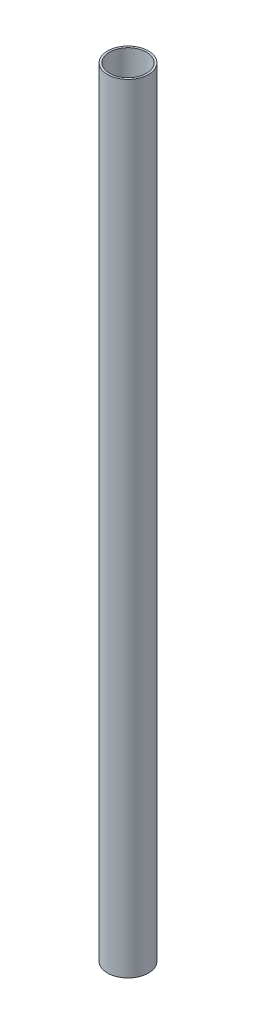
ISO-10303-21;
HEADER;
FILE_DESCRIPTION(('STEP AP214'),'2;1');
FILE_NAME('part.step','',(''),(''),'','','');
FILE_SCHEMA(('AUTOMOTIVE_DESIGN { 1 0 10303 214 1 1 1 1 }'));
ENDSEC;
DATA;
#1=APPLICATION_CONTEXT('core data for automotive mechanical design processes');
#2=APPLICATION_PROTOCOL_DEFINITION('international standard','automotive_design',2000,#1);
#3=PRODUCT_CONTEXT('',#1,'mechanical');
#4=PRODUCT('Part','Part','',(#3));
#5=PRODUCT_RELATED_PRODUCT_CATEGORY('part','',(#4));
#6=PRODUCT_DEFINITION_FORMATION('','',#4);
#7=PRODUCT_DEFINITION_CONTEXT('part definition',#1,'design');
#8=PRODUCT_DEFINITION('design','',#6,#7);
#9=PRODUCT_DEFINITION_SHAPE('','',#8);
#10=(LENGTH_UNIT() NAMED_UNIT(*) SI_UNIT(.MILLI.,.METRE.));
#11=(NAMED_UNIT(*) PLANE_ANGLE_UNIT() SI_UNIT($,.RADIAN.));
#12=(NAMED_UNIT(*) SI_UNIT($,.STERADIAN.) SOLID_ANGLE_UNIT());
#13=UNCERTAINTY_MEASURE_WITH_UNIT(LENGTH_MEASURE(1.E-05),#10,'distance_accuracy_value','');
#14=(GEOMETRIC_REPRESENTATION_CONTEXT(3) GLOBAL_UNCERTAINTY_ASSIGNED_CONTEXT((#13)) GLOBAL_UNIT_ASSIGNED_CONTEXT((#10,
#11,#12)) REPRESENTATION_CONTEXT('',''));
#15=CARTESIAN_POINT('',(0.,0.,0.));
#16=DIRECTION('',(0.,0.,1.));
#17=DIRECTION('',(1.,0.,0.));
#18=AXIS2_PLACEMENT_3D('',#15,#16,#17);
#19=CARTESIAN_POINT('',(0.,380.,0.));
#20=DIRECTION('',(0.,1.,0.));
#21=DIRECTION('',(0.,0.,1.));
#22=AXIS2_PLACEMENT_3D('',#19,#20,#21);
#23=PLANE('',#22);
#24=CARTESIAN_POINT('',(0.,380.,0.));
#25=DIRECTION('',(0.,1.,0.));
#26=DIRECTION('',(0.,0.,1.));
#27=AXIS2_PLACEMENT_3D('',#24,#25,#26);
#28=CIRCLE('',#27,10.);
#29=CARTESIAN_POINT('',(0.,380.,10.));
#30=VERTEX_POINT('',#29);
#31=EDGE_CURVE('E10',#30,#30,#28,.T.);
#32=ORIENTED_EDGE('',*,*,#31,.T.);
#33=EDGE_LOOP('',(#32));
#34=FACE_BOUND('',#33,.T.);
#35=CARTESIAN_POINT('',(0.,380.,0.));
#36=DIRECTION('',(0.,1.,0.));
#37=DIRECTION('',(0.,0.,1.));
#38=AXIS2_PLACEMENT_3D('',#35,#36,#37);
#39=CIRCLE('',#38,9.);
#40=CARTESIAN_POINT('',(0.,380.,9.));
#41=VERTEX_POINT('',#40);
#42=EDGE_CURVE('E54',#41,#41,#39,.T.);
#43=ORIENTED_EDGE('',*,*,#42,.F.);
#44=EDGE_LOOP('',(#43));
#45=FACE_BOUND('',#44,.T.);
#46=ADVANCED_FACE('F41',(#34,#45),#23,.T.);
#47=CARTESIAN_POINT('',(0.,0.,0.));
#48=DIRECTION('',(0.,1.,0.));
#49=DIRECTION('',(0.,0.,1.));
#50=AXIS2_PLACEMENT_3D('',#47,#48,#49);
#51=PLANE('',#50);
#52=CARTESIAN_POINT('',(0.,0.,0.));
#53=DIRECTION('',(0.,1.,0.));
#54=DIRECTION('',(0.,0.,1.));
#55=AXIS2_PLACEMENT_3D('',#52,#53,#54);
#56=CIRCLE('',#55,10.);
#57=CARTESIAN_POINT('',(0.,0.,10.));
#58=VERTEX_POINT('',#57);
#59=EDGE_CURVE('E45',#58,#58,#56,.T.);
#60=ORIENTED_EDGE('',*,*,#59,.F.);
#61=EDGE_LOOP('',(#60));
#62=FACE_BOUND('',#61,.T.);
#63=CARTESIAN_POINT('',(0.,0.,0.));
#64=DIRECTION('',(0.,1.,0.));
#65=DIRECTION('',(0.,0.,1.));
#66=AXIS2_PLACEMENT_3D('',#63,#64,#65);
#67=CIRCLE('',#66,9.);
#68=CARTESIAN_POINT('',(0.,0.,9.));
#69=VERTEX_POINT('',#68);
#70=EDGE_CURVE('E56',#69,#69,#67,.T.);
#71=ORIENTED_EDGE('',*,*,#70,.T.);
#72=EDGE_LOOP('',(#71));
#73=FACE_BOUND('',#72,.T.);
#74=ADVANCED_FACE('F68',(#62,#73),#51,.F.);
#75=CARTESIAN_POINT('',(0.,380.,0.));
#76=DIRECTION('',(0.,-1.,0.));
#77=DIRECTION('',(0.,0.,-1.));
#78=AXIS2_PLACEMENT_3D('',#75,#76,#77);
#79=CYLINDRICAL_SURFACE('',#78,10.);
#80=ORIENTED_EDGE('',*,*,#31,.F.);
#81=EDGE_LOOP('',(#80));
#82=FACE_BOUND('',#81,.T.);
#83=ORIENTED_EDGE('',*,*,#59,.T.);
#84=EDGE_LOOP('',(#83));
#85=FACE_BOUND('',#84,.T.);
#86=ADVANCED_FACE('F43',(#82,#85),#79,.T.);
#87=CARTESIAN_POINT('',(0.,380.,0.));
#88=DIRECTION('',(0.,-1.,0.));
#89=DIRECTION('',(0.,0.,-1.));
#90=AXIS2_PLACEMENT_3D('',#87,#88,#89);
#91=CYLINDRICAL_SURFACE('',#90,9.);
#92=ORIENTED_EDGE('',*,*,#42,.T.);
#93=EDGE_LOOP('',(#92));
#94=FACE_BOUND('',#93,.T.);
#95=ORIENTED_EDGE('',*,*,#70,.F.);
#96=EDGE_LOOP('',(#95));
#97=FACE_BOUND('',#96,.T.);
#98=ADVANCED_FACE('F64',(#94,#97),#91,.F.);
#99=CLOSED_SHELL('',(#46,#74,#86,#98));
#100=MANIFOLD_SOLID_BREP('B2',#99);
#101=ADVANCED_BREP_SHAPE_REPRESENTATION('',(#18,#100),#14);
#102=SHAPE_DEFINITION_REPRESENTATION(#9,#101);
ENDSEC;
END-ISO-10303-21;
